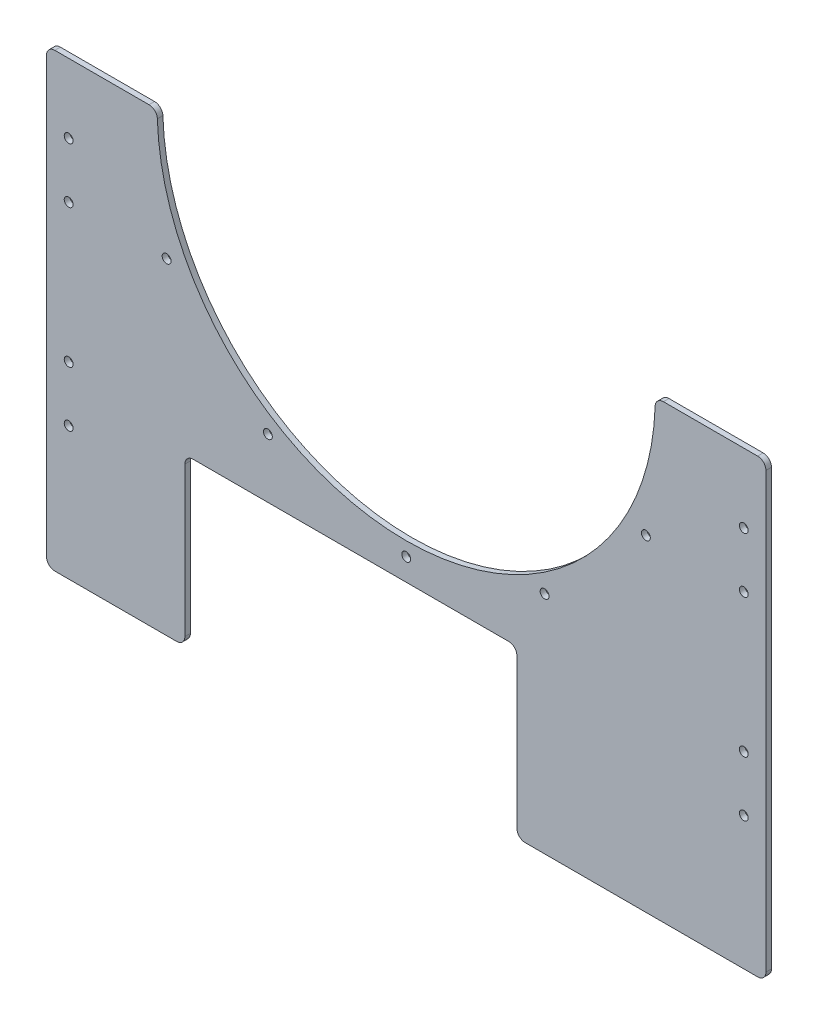
ISO-10303-21;
HEADER;
FILE_DESCRIPTION(('STEP AP214'),'2;1');
FILE_NAME('part.step','',(''),(''),'','','');
FILE_SCHEMA(('AUTOMOTIVE_DESIGN { 1 0 10303 214 1 1 1 1 }'));
ENDSEC;
DATA;
#1=APPLICATION_CONTEXT('core data for automotive mechanical design processes');
#2=APPLICATION_PROTOCOL_DEFINITION('international standard','automotive_design',2000,#1);
#3=PRODUCT_CONTEXT('',#1,'mechanical');
#4=PRODUCT('Part','Part','',(#3));
#5=PRODUCT_RELATED_PRODUCT_CATEGORY('part','',(#4));
#6=PRODUCT_DEFINITION_FORMATION('','',#4);
#7=PRODUCT_DEFINITION_CONTEXT('part definition',#1,'design');
#8=PRODUCT_DEFINITION('design','',#6,#7);
#9=PRODUCT_DEFINITION_SHAPE('','',#8);
#10=(LENGTH_UNIT() NAMED_UNIT(*) SI_UNIT(.MILLI.,.METRE.));
#11=(NAMED_UNIT(*) PLANE_ANGLE_UNIT() SI_UNIT($,.RADIAN.));
#12=(NAMED_UNIT(*) SI_UNIT($,.STERADIAN.) SOLID_ANGLE_UNIT());
#13=UNCERTAINTY_MEASURE_WITH_UNIT(LENGTH_MEASURE(1.E-05),#10,'distance_accuracy_value','');
#14=(GEOMETRIC_REPRESENTATION_CONTEXT(3) GLOBAL_UNCERTAINTY_ASSIGNED_CONTEXT((#13)) GLOBAL_UNIT_ASSIGNED_CONTEXT((#10,
#11,#12)) REPRESENTATION_CONTEXT('',''));
#15=CARTESIAN_POINT('',(0.,0.,0.));
#16=DIRECTION('',(0.,0.,1.));
#17=DIRECTION('',(1.,0.,0.));
#18=AXIS2_PLACEMENT_3D('',#15,#16,#17);
#19=CARTESIAN_POINT('',(130.,-81.5,2.));
#20=DIRECTION('',(0.,1.,0.));
#21=DIRECTION('',(-1.,0.,0.));
#22=AXIS2_PLACEMENT_3D('',#19,#20,#21);
#23=PLANE('',#22);
#24=DIRECTION('',(1.,0.,0.));
#25=VECTOR('',#24,1.);
#26=CARTESIAN_POINT('',(130.,-81.5,0.));
#27=LINE('',#26,#25);
#28=CARTESIAN_POINT('',(-127.,-81.5,0.));
#29=VERTEX_POINT('',#28);
#30=CARTESIAN_POINT('',(-83.,-81.5,0.));
#31=VERTEX_POINT('',#30);
#32=EDGE_CURVE('E415',#29,#31,#27,.T.);
#33=ORIENTED_EDGE('',*,*,#32,.T.);
#34=DIRECTION('',(0.,0.,1.));
#35=VECTOR('',#34,1.);
#36=CARTESIAN_POINT('',(-83.,-81.5,2.));
#37=LINE('',#36,#35);
#38=CARTESIAN_POINT('',(-83.,-81.5,2.));
#39=VERTEX_POINT('',#38);
#40=EDGE_CURVE('E243',#31,#39,#37,.T.);
#41=ORIENTED_EDGE('',*,*,#40,.T.);
#42=DIRECTION('',(1.,0.,0.));
#43=VECTOR('',#42,1.);
#44=CARTESIAN_POINT('',(130.,-81.5,2.));
#45=LINE('',#44,#43);
#46=CARTESIAN_POINT('',(-127.,-81.5,2.));
#47=VERTEX_POINT('',#46);
#48=EDGE_CURVE('E406',#47,#39,#45,.T.);
#49=ORIENTED_EDGE('',*,*,#48,.F.);
#50=DIRECTION('',(0.,0.,-1.));
#51=VECTOR('',#50,1.);
#52=CARTESIAN_POINT('',(-127.,-81.5,2.));
#53=LINE('',#52,#51);
#54=EDGE_CURVE('E230',#47,#29,#53,.T.);
#55=ORIENTED_EDGE('',*,*,#54,.T.);
#56=EDGE_LOOP('',(#33,#41,#49,#55));
#57=FACE_BOUND('',#56,.T.);
#58=ADVANCED_FACE('F34',(#57),#23,.F.);
#59=CARTESIAN_POINT('',(130.,81.5,2.));
#60=DIRECTION('',(0.,-1.,0.));
#61=DIRECTION('',(1.,0.,0.));
#62=AXIS2_PLACEMENT_3D('',#59,#60,#61);
#63=PLANE('',#62);
#64=DIRECTION('',(-1.,0.,0.));
#65=VECTOR('',#64,1.);
#66=CARTESIAN_POINT('',(130.,81.5,0.));
#67=LINE('',#66,#65);
#68=CARTESIAN_POINT('',(127.,81.5,0.));
#69=VERTEX_POINT('',#68);
#70=CARTESIAN_POINT('',(92.951600308978,81.5,0.));
#71=VERTEX_POINT('',#70);
#72=EDGE_CURVE('E189',#69,#71,#67,.T.);
#73=ORIENTED_EDGE('',*,*,#72,.T.);
#74=DIRECTION('',(0.,0.,1.));
#75=VECTOR('',#74,1.);
#76=CARTESIAN_POINT('',(92.951600308978,81.5,2.));
#77=LINE('',#76,#75);
#78=CARTESIAN_POINT('',(92.951600308978,81.5,2.));
#79=VERTEX_POINT('',#78);
#80=EDGE_CURVE('E265',#71,#79,#77,.T.);
#81=ORIENTED_EDGE('',*,*,#80,.T.);
#82=DIRECTION('',(-1.,0.,0.));
#83=VECTOR('',#82,1.);
#84=CARTESIAN_POINT('',(130.,81.5,2.));
#85=LINE('',#84,#83);
#86=CARTESIAN_POINT('',(127.,81.5,2.));
#87=VERTEX_POINT('',#86);
#88=EDGE_CURVE('E192',#87,#79,#85,.T.);
#89=ORIENTED_EDGE('',*,*,#88,.F.);
#90=DIRECTION('',(0.,0.,-1.));
#91=VECTOR('',#90,1.);
#92=CARTESIAN_POINT('',(127.,81.5,2.));
#93=LINE('',#92,#91);
#94=EDGE_CURVE('E176',#87,#69,#93,.T.);
#95=ORIENTED_EDGE('',*,*,#94,.T.);
#96=EDGE_LOOP('',(#73,#81,#89,#95));
#97=FACE_BOUND('',#96,.T.);
#98=ADVANCED_FACE('F187',(#97),#63,.F.);
#99=CARTESIAN_POINT('',(-130.,-81.5,2.));
#100=DIRECTION('',(1.,0.,0.));
#101=DIRECTION('',(0.,0.,-1.));
#102=AXIS2_PLACEMENT_3D('',#99,#100,#101);
#103=PLANE('',#102);
#104=DIRECTION('',(0.,-1.,0.));
#105=VECTOR('',#104,1.);
#106=CARTESIAN_POINT('',(-130.,-81.5,0.));
#107=LINE('',#106,#105);
#108=CARTESIAN_POINT('',(-130.,78.5,0.));
#109=VERTEX_POINT('',#108);
#110=CARTESIAN_POINT('',(-130.,-78.5,0.));
#111=VERTEX_POINT('',#110);
#112=EDGE_CURVE('E403',#109,#111,#107,.T.);
#113=ORIENTED_EDGE('',*,*,#112,.T.);
#114=DIRECTION('',(0.,0.,-1.));
#115=VECTOR('',#114,1.);
#116=CARTESIAN_POINT('',(-130.,-78.5,2.));
#117=LINE('',#116,#115);
#118=CARTESIAN_POINT('',(-130.,-78.5,2.));
#119=VERTEX_POINT('',#118);
#120=EDGE_CURVE('E239',#111,#119,#117,.F.);
#121=ORIENTED_EDGE('',*,*,#120,.T.);
#122=DIRECTION('',(0.,-1.,0.));
#123=VECTOR('',#122,1.);
#124=CARTESIAN_POINT('',(-130.,-81.5,2.));
#125=LINE('',#124,#123);
#126=CARTESIAN_POINT('',(-130.,78.5,2.));
#127=VERTEX_POINT('',#126);
#128=EDGE_CURVE('E201',#127,#119,#125,.T.);
#129=ORIENTED_EDGE('',*,*,#128,.F.);
#130=DIRECTION('',(0.,0.,-1.));
#131=VECTOR('',#130,1.);
#132=CARTESIAN_POINT('',(-130.,78.5,2.));
#133=LINE('',#132,#131);
#134=EDGE_CURVE('E236',#127,#109,#133,.T.);
#135=ORIENTED_EDGE('',*,*,#134,.T.);
#136=EDGE_LOOP('',(#113,#121,#129,#135));
#137=FACE_BOUND('',#136,.T.);
#138=ADVANCED_FACE('F441',(#137),#103,.F.);
#139=CARTESIAN_POINT('',(43.,-81.5,2.));
#140=VERTEX_POINT('',#139);
#141=CARTESIAN_POINT('',(127.,-81.5,2.));
#142=VERTEX_POINT('',#141);
#143=EDGE_CURVE('E205',#140,#142,#45,.T.);
#144=ORIENTED_EDGE('',*,*,#143,.F.);
#145=DIRECTION('',(0.,0.,1.));
#146=VECTOR('',#145,1.);
#147=CARTESIAN_POINT('',(43.,-81.5,2.));
#148=LINE('',#147,#146);
#149=CARTESIAN_POINT('',(43.,-81.5,0.));
#150=VERTEX_POINT('',#149);
#151=EDGE_CURVE('E275',#140,#150,#148,.F.);
#152=ORIENTED_EDGE('',*,*,#151,.T.);
#153=CARTESIAN_POINT('',(127.,-81.5,0.));
#154=VERTEX_POINT('',#153);
#155=EDGE_CURVE('E414',#150,#154,#27,.T.);
#156=ORIENTED_EDGE('',*,*,#155,.T.);
#157=DIRECTION('',(0.,0.,-1.));
#158=VECTOR('',#157,1.);
#159=CARTESIAN_POINT('',(127.,-81.5,2.));
#160=LINE('',#159,#158);
#161=EDGE_CURVE('E233',#154,#142,#160,.F.);
#162=ORIENTED_EDGE('',*,*,#161,.T.);
#163=EDGE_LOOP('',(#144,#152,#156,#162));
#164=FACE_BOUND('',#163,.T.);
#165=ADVANCED_FACE('F422',(#164),#23,.F.);
#166=CARTESIAN_POINT('',(130.,-81.5,2.));
#167=DIRECTION('',(-1.,0.,0.));
#168=DIRECTION('',(0.,0.,1.));
#169=AXIS2_PLACEMENT_3D('',#166,#167,#168);
#170=PLANE('',#169);
#171=DIRECTION('',(0.,1.,0.));
#172=VECTOR('',#171,1.);
#173=CARTESIAN_POINT('',(130.,-81.5,0.));
#174=LINE('',#173,#172);
#175=CARTESIAN_POINT('',(130.,-78.5,0.));
#176=VERTEX_POINT('',#175);
#177=CARTESIAN_POINT('',(130.,78.5,0.));
#178=VERTEX_POINT('',#177);
#179=EDGE_CURVE('E207',#176,#178,#174,.T.);
#180=ORIENTED_EDGE('',*,*,#179,.T.);
#181=DIRECTION('',(0.,0.,-1.));
#182=VECTOR('',#181,1.);
#183=CARTESIAN_POINT('',(130.,78.5,2.));
#184=LINE('',#183,#182);
#185=CARTESIAN_POINT('',(130.,78.5,2.));
#186=VERTEX_POINT('',#185);
#187=EDGE_CURVE('E177',#178,#186,#184,.F.);
#188=ORIENTED_EDGE('',*,*,#187,.T.);
#189=DIRECTION('',(0.,1.,0.));
#190=VECTOR('',#189,1.);
#191=CARTESIAN_POINT('',(130.,-81.5,2.));
#192=LINE('',#191,#190);
#193=CARTESIAN_POINT('',(130.,-78.5,2.));
#194=VERTEX_POINT('',#193);
#195=EDGE_CURVE('E408',#194,#186,#192,.T.);
#196=ORIENTED_EDGE('',*,*,#195,.F.);
#197=DIRECTION('',(0.,0.,-1.));
#198=VECTOR('',#197,1.);
#199=CARTESIAN_POINT('',(130.,-78.5,2.));
#200=LINE('',#199,#198);
#201=EDGE_CURVE('E181',#194,#176,#200,.T.);
#202=ORIENTED_EDGE('',*,*,#201,.T.);
#203=EDGE_LOOP('',(#180,#188,#196,#202));
#204=FACE_BOUND('',#203,.T.);
#205=ADVANCED_FACE('F431',(#204),#170,.F.);
#206=CARTESIAN_POINT('',(-92.951600308978,81.5,2.));
#207=VERTEX_POINT('',#206);
#208=CARTESIAN_POINT('',(-127.,81.5,2.));
#209=VERTEX_POINT('',#208);
#210=EDGE_CURVE('E411',#207,#209,#85,.T.);
#211=ORIENTED_EDGE('',*,*,#210,.F.);
#212=DIRECTION('',(0.,0.,1.));
#213=VECTOR('',#212,1.);
#214=CARTESIAN_POINT('',(-92.951600308978,81.5,2.));
#215=LINE('',#214,#213);
#216=CARTESIAN_POINT('',(-92.951600308978,81.5,0.));
#217=VERTEX_POINT('',#216);
#218=EDGE_CURVE('E282',#207,#217,#215,.F.);
#219=ORIENTED_EDGE('',*,*,#218,.T.);
#220=CARTESIAN_POINT('',(-127.,81.5,0.));
#221=VERTEX_POINT('',#220);
#222=EDGE_CURVE('E202',#217,#221,#67,.T.);
#223=ORIENTED_EDGE('',*,*,#222,.T.);
#224=DIRECTION('',(0.,0.,-1.));
#225=VECTOR('',#224,1.);
#226=CARTESIAN_POINT('',(-127.,81.5,2.));
#227=LINE('',#226,#225);
#228=EDGE_CURVE('E194',#221,#209,#227,.F.);
#229=ORIENTED_EDGE('',*,*,#228,.T.);
#230=EDGE_LOOP('',(#211,#219,#223,#229));
#231=FACE_BOUND('',#230,.T.);
#232=ADVANCED_FACE('F433',(#231),#63,.F.);
#233=CARTESIAN_POINT('',(0.,0.,2.));
#234=DIRECTION('',(0.,0.,1.));
#235=DIRECTION('',(1.,0.,0.));
#236=AXIS2_PLACEMENT_3D('',#233,#234,#235);
#237=PLANE('',#236);
#238=ORIENTED_EDGE('',*,*,#48,.T.);
#239=CARTESIAN_POINT('',(-83.,-78.5,2.));
#240=DIRECTION('',(0.,0.,1.));
#241=DIRECTION('',(1.,0.,0.));
#242=AXIS2_PLACEMENT_3D('',#239,#240,#241);
#243=CIRCLE('',#242,3.);
#244=CARTESIAN_POINT('',(-80.,-78.5,2.));
#245=VERTEX_POINT('',#244);
#246=EDGE_CURVE('E252',#39,#245,#243,.T.);
#247=ORIENTED_EDGE('',*,*,#246,.T.);
#248=DIRECTION('',(0.,-1.,0.));
#249=VECTOR('',#248,1.);
#250=CARTESIAN_POINT('',(-80.,-81.5,2.));
#251=LINE('',#250,#249);
#252=CARTESIAN_POINT('',(-80.,-24.5,2.));
#253=VERTEX_POINT('',#252);
#254=EDGE_CURVE('E297',#253,#245,#251,.T.);
#255=ORIENTED_EDGE('',*,*,#254,.F.);
#256=CARTESIAN_POINT('',(-77.,-24.5,2.));
#257=DIRECTION('',(0.,0.,1.));
#258=DIRECTION('',(1.,0.,0.));
#259=AXIS2_PLACEMENT_3D('',#256,#257,#258);
#260=CIRCLE('',#259,3.);
#261=CARTESIAN_POINT('',(-77.,-21.5,2.));
#262=VERTEX_POINT('',#261);
#263=EDGE_CURVE('E42',#253,#262,#260,.F.);
#264=ORIENTED_EDGE('',*,*,#263,.T.);
#265=DIRECTION('',(-1.,0.,0.));
#266=VECTOR('',#265,1.);
#267=CARTESIAN_POINT('',(-80.,-21.5,2.));
#268=LINE('',#267,#266);
#269=CARTESIAN_POINT('',(37.,-21.5,2.));
#270=VERTEX_POINT('',#269);
#271=EDGE_CURVE('E295',#270,#262,#268,.T.);
#272=ORIENTED_EDGE('',*,*,#271,.F.);
#273=CARTESIAN_POINT('',(37.,-24.5,2.));
#274=DIRECTION('',(0.,0.,1.));
#275=DIRECTION('',(1.,0.,0.));
#276=AXIS2_PLACEMENT_3D('',#273,#274,#275);
#277=CIRCLE('',#276,3.);
#278=CARTESIAN_POINT('',(40.,-24.5,2.));
#279=VERTEX_POINT('',#278);
#280=EDGE_CURVE('E285',#270,#279,#277,.F.);
#281=ORIENTED_EDGE('',*,*,#280,.T.);
#282=DIRECTION('',(0.,1.,0.));
#283=VECTOR('',#282,1.);
#284=CARTESIAN_POINT('',(40.,-81.5,2.));
#285=LINE('',#284,#283);
#286=CARTESIAN_POINT('',(40.,-78.5,2.));
#287=VERTEX_POINT('',#286);
#288=EDGE_CURVE('E307',#287,#279,#285,.T.);
#289=ORIENTED_EDGE('',*,*,#288,.F.);
#290=CARTESIAN_POINT('',(43.,-78.5,2.));
#291=DIRECTION('',(0.,0.,1.));
#292=DIRECTION('',(1.,0.,0.));
#293=AXIS2_PLACEMENT_3D('',#290,#291,#292);
#294=CIRCLE('',#293,3.);
#295=EDGE_CURVE('E248',#287,#140,#294,.T.);
#296=ORIENTED_EDGE('',*,*,#295,.T.);
#297=ORIENTED_EDGE('',*,*,#143,.T.);
#298=CARTESIAN_POINT('',(127.,-78.5,2.));
#299=DIRECTION('',(0.,0.,1.));
#300=DIRECTION('',(1.,0.,0.));
#301=AXIS2_PLACEMENT_3D('',#298,#299,#300);
#302=CIRCLE('',#301,3.);
#303=EDGE_CURVE('E226',#142,#194,#302,.T.);
#304=ORIENTED_EDGE('',*,*,#303,.T.);
#305=ORIENTED_EDGE('',*,*,#195,.T.);
#306=CARTESIAN_POINT('',(127.,78.5,2.));
#307=DIRECTION('',(0.,0.,1.));
#308=DIRECTION('',(1.,0.,0.));
#309=AXIS2_PLACEMENT_3D('',#306,#307,#308);
#310=CIRCLE('',#309,3.);
#311=EDGE_CURVE('E228',#186,#87,#310,.T.);
#312=ORIENTED_EDGE('',*,*,#311,.T.);
#313=ORIENTED_EDGE('',*,*,#88,.T.);
#314=CARTESIAN_POINT('',(92.951600308978,78.5,2.));
#315=DIRECTION('',(0.,0.,1.));
#316=DIRECTION('',(1.,0.,0.));
#317=AXIS2_PLACEMENT_3D('',#314,#315,#316);
#318=CIRCLE('',#317,3.);
#319=CARTESIAN_POINT('',(89.9531615893336,78.5967741935484,2.));
#320=VERTEX_POINT('',#319);
#321=EDGE_CURVE('E250',#79,#320,#318,.T.);
#322=ORIENTED_EDGE('',*,*,#321,.T.);
#323=CARTESIAN_POINT('',(0.,81.5,2.));
#324=DIRECTION('',(0.,0.,1.));
#325=DIRECTION('',(1.,0.,0.));
#326=AXIS2_PLACEMENT_3D('',#323,#324,#325);
#327=CIRCLE('',#326,90.);
#328=CARTESIAN_POINT('',(-89.9531615893336,78.5967741935484,2.));
#329=VERTEX_POINT('',#328);
#330=EDGE_CURVE('E334',#329,#320,#327,.T.);
#331=ORIENTED_EDGE('',*,*,#330,.F.);
#332=CARTESIAN_POINT('',(-92.951600308978,78.5,2.));
#333=DIRECTION('',(0.,0.,1.));
#334=DIRECTION('',(1.,0.,0.));
#335=AXIS2_PLACEMENT_3D('',#332,#333,#334);
#336=CIRCLE('',#335,3.);
#337=EDGE_CURVE('E246',#329,#207,#336,.T.);
#338=ORIENTED_EDGE('',*,*,#337,.T.);
#339=ORIENTED_EDGE('',*,*,#210,.T.);
#340=CARTESIAN_POINT('',(-127.,78.5,2.));
#341=DIRECTION('',(0.,0.,1.));
#342=DIRECTION('',(1.,0.,0.));
#343=AXIS2_PLACEMENT_3D('',#340,#341,#342);
#344=CIRCLE('',#343,3.);
#345=EDGE_CURVE('E222',#209,#127,#344,.T.);
#346=ORIENTED_EDGE('',*,*,#345,.T.);
#347=ORIENTED_EDGE('',*,*,#128,.T.);
#348=CARTESIAN_POINT('',(-127.,-78.5,2.));
#349=DIRECTION('',(0.,0.,1.));
#350=DIRECTION('',(1.,0.,0.));
#351=AXIS2_PLACEMENT_3D('',#348,#349,#350);
#352=CIRCLE('',#351,3.);
#353=EDGE_CURVE('E224',#119,#47,#352,.T.);
#354=ORIENTED_EDGE('',*,*,#353,.T.);
#355=EDGE_LOOP('',(#238,#247,#255,#264,#272,#281,#289,#296,#297,#304,#305,#312,#313,#322,#331,
#338,#339,#346,#347,#354));
#356=FACE_BOUND('',#355,.T.);
#357=CARTESIAN_POINT('',(0.,-13.5,2.));
#358=DIRECTION('',(0.,0.,1.));
#359=DIRECTION('',(1.,0.,0.));
#360=AXIS2_PLACEMENT_3D('',#357,#358,#359);
#361=CIRCLE('',#360,1.6);
#362=CARTESIAN_POINT('',(1.6,-13.5,2.));
#363=VERTEX_POINT('',#362);
#364=EDGE_CURVE('E335',#363,#363,#361,.T.);
#365=ORIENTED_EDGE('',*,*,#364,.F.);
#366=EDGE_LOOP('',(#365));
#367=FACE_BOUND('',#366,.T.);
#368=CARTESIAN_POINT('',(-50.,-0.102540378443875,2.));
#369=DIRECTION('',(0.,0.,1.));
#370=DIRECTION('',(1.,0.,0.));
#371=AXIS2_PLACEMENT_3D('',#368,#369,#370);
#372=CIRCLE('',#371,1.6);
#373=CARTESIAN_POINT('',(-48.4,-0.102540378443875,2.));
#374=VERTEX_POINT('',#373);
#375=EDGE_CURVE('E341',#374,#374,#372,.T.);
#376=ORIENTED_EDGE('',*,*,#375,.F.);
#377=EDGE_LOOP('',(#376));
#378=FACE_BOUND('',#377,.T.);
#379=CARTESIAN_POINT('',(-86.6025403784439,36.5,2.));
#380=DIRECTION('',(0.,0.,1.));
#381=DIRECTION('',(1.,0.,0.));
#382=AXIS2_PLACEMENT_3D('',#379,#380,#381);
#383=CIRCLE('',#382,1.60000000000001);
#384=CARTESIAN_POINT('',(-85.0025403784439,36.5,2.));
#385=VERTEX_POINT('',#384);
#386=EDGE_CURVE('E347',#385,#385,#383,.T.);
#387=ORIENTED_EDGE('',*,*,#386,.F.);
#388=EDGE_LOOP('',(#387));
#389=FACE_BOUND('',#388,.T.);
#390=CARTESIAN_POINT('',(86.6025403784439,36.5,2.));
#391=DIRECTION('',(0.,0.,1.));
#392=DIRECTION('',(1.,0.,0.));
#393=AXIS2_PLACEMENT_3D('',#390,#391,#392);
#394=CIRCLE('',#393,1.60000000000001);
#395=CARTESIAN_POINT('',(88.2025403784439,36.5,2.));
#396=VERTEX_POINT('',#395);
#397=EDGE_CURVE('E328',#396,#396,#394,.T.);
#398=ORIENTED_EDGE('',*,*,#397,.F.);
#399=EDGE_LOOP('',(#398));
#400=FACE_BOUND('',#399,.T.);
#401=CARTESIAN_POINT('',(50.0000000000001,-0.102540378443844,2.));
#402=DIRECTION('',(0.,0.,1.));
#403=DIRECTION('',(1.,0.,0.));
#404=AXIS2_PLACEMENT_3D('',#401,#402,#403);
#405=CIRCLE('',#404,1.6);
#406=CARTESIAN_POINT('',(51.6000000000001,-0.102540378443844,2.));
#407=VERTEX_POINT('',#406);
#408=EDGE_CURVE('E322',#407,#407,#405,.T.);
#409=ORIENTED_EDGE('',*,*,#408,.F.);
#410=EDGE_LOOP('',(#409));
#411=FACE_BOUND('',#410,.T.);
#412=CARTESIAN_POINT('',(-122.,-13.5,2.));
#413=DIRECTION('',(0.,0.,1.));
#414=DIRECTION('',(1.,0.,0.));
#415=AXIS2_PLACEMENT_3D('',#412,#413,#414);
#416=CIRCLE('',#415,1.60000000000002);
#417=CARTESIAN_POINT('',(-120.4,-13.5,2.));
#418=VERTEX_POINT('',#417);
#419=EDGE_CURVE('E380',#418,#418,#416,.T.);
#420=ORIENTED_EDGE('',*,*,#419,.F.);
#421=EDGE_LOOP('',(#420));
#422=FACE_BOUND('',#421,.T.);
#423=CARTESIAN_POINT('',(-122.,36.5,2.));
#424=DIRECTION('',(0.,0.,1.));
#425=DIRECTION('',(1.,0.,0.));
#426=AXIS2_PLACEMENT_3D('',#423,#424,#425);
#427=CIRCLE('',#426,1.60000000000002);
#428=CARTESIAN_POINT('',(-120.4,36.5,2.));
#429=VERTEX_POINT('',#428);
#430=EDGE_CURVE('E386',#429,#429,#427,.T.);
#431=ORIENTED_EDGE('',*,*,#430,.F.);
#432=EDGE_LOOP('',(#431));
#433=FACE_BOUND('',#432,.T.);
#434=CARTESIAN_POINT('',(-122.,56.5,2.));
#435=DIRECTION('',(0.,0.,1.));
#436=DIRECTION('',(1.,0.,0.));
#437=AXIS2_PLACEMENT_3D('',#434,#435,#436);
#438=CIRCLE('',#437,1.60000000000002);
#439=CARTESIAN_POINT('',(-120.4,56.5,2.));
#440=VERTEX_POINT('',#439);
#441=EDGE_CURVE('E392',#440,#440,#438,.T.);
#442=ORIENTED_EDGE('',*,*,#441,.F.);
#443=EDGE_LOOP('',(#442));
#444=FACE_BOUND('',#443,.T.);
#445=CARTESIAN_POINT('',(122.,56.5,2.));
#446=DIRECTION('',(0.,0.,1.));
#447=DIRECTION('',(-1.,0.,0.));
#448=AXIS2_PLACEMENT_3D('',#445,#446,#447);
#449=CIRCLE('',#448,1.60000000000002);
#450=CARTESIAN_POINT('',(120.4,56.5,2.));
#451=VERTEX_POINT('',#450);
#452=EDGE_CURVE('E361',#451,#451,#449,.T.);
#453=ORIENTED_EDGE('',*,*,#452,.F.);
#454=EDGE_LOOP('',(#453));
#455=FACE_BOUND('',#454,.T.);
#456=CARTESIAN_POINT('',(122.,36.5,2.));
#457=DIRECTION('',(0.,0.,1.));
#458=DIRECTION('',(-1.,0.,0.));
#459=AXIS2_PLACEMENT_3D('',#456,#457,#458);
#460=CIRCLE('',#459,1.60000000000002);
#461=CARTESIAN_POINT('',(120.4,36.5,2.));
#462=VERTEX_POINT('',#461);
#463=EDGE_CURVE('E362',#462,#462,#460,.T.);
#464=ORIENTED_EDGE('',*,*,#463,.F.);
#465=EDGE_LOOP('',(#464));
#466=FACE_BOUND('',#465,.T.);
#467=CARTESIAN_POINT('',(122.,-13.5,2.));
#468=DIRECTION('',(0.,0.,1.));
#469=DIRECTION('',(-1.,0.,0.));
#470=AXIS2_PLACEMENT_3D('',#467,#468,#469);
#471=CIRCLE('',#470,1.60000000000002);
#472=CARTESIAN_POINT('',(120.4,-13.5,2.));
#473=VERTEX_POINT('',#472);
#474=EDGE_CURVE('E368',#473,#473,#471,.T.);
#475=ORIENTED_EDGE('',*,*,#474,.F.);
#476=EDGE_LOOP('',(#475));
#477=FACE_BOUND('',#476,.T.);
#478=CARTESIAN_POINT('',(122.,-33.5,2.));
#479=DIRECTION('',(0.,0.,1.));
#480=DIRECTION('',(-1.,0.,0.));
#481=AXIS2_PLACEMENT_3D('',#478,#479,#480);
#482=CIRCLE('',#481,1.60000000000002);
#483=CARTESIAN_POINT('',(120.4,-33.5,2.));
#484=VERTEX_POINT('',#483);
#485=EDGE_CURVE('E357',#484,#484,#482,.T.);
#486=ORIENTED_EDGE('',*,*,#485,.F.);
#487=EDGE_LOOP('',(#486));
#488=FACE_BOUND('',#487,.T.);
#489=CARTESIAN_POINT('',(-122.,-33.5,2.));
#490=DIRECTION('',(0.,0.,1.));
#491=DIRECTION('',(1.,0.,0.));
#492=AXIS2_PLACEMENT_3D('',#489,#490,#491);
#493=CIRCLE('',#492,1.60000000000002);
#494=CARTESIAN_POINT('',(-120.4,-33.5,2.));
#495=VERTEX_POINT('',#494);
#496=EDGE_CURVE('E379',#495,#495,#493,.T.);
#497=ORIENTED_EDGE('',*,*,#496,.F.);
#498=EDGE_LOOP('',(#497));
#499=FACE_BOUND('',#498,.T.);
#500=ADVANCED_FACE('F293',(#356,#367,#378,#389,#400,#411,#422,#433,#444,#455,#466,#477,#488,
#499),#237,.T.);
#501=CARTESIAN_POINT('',(0.,0.,0.));
#502=DIRECTION('',(0.,0.,1.));
#503=DIRECTION('',(1.,0.,0.));
#504=AXIS2_PLACEMENT_3D('',#501,#502,#503);
#505=PLANE('',#504);
#506=CARTESIAN_POINT('',(0.,-13.5,0.));
#507=DIRECTION('',(0.,0.,1.));
#508=DIRECTION('',(1.,0.,0.));
#509=AXIS2_PLACEMENT_3D('',#506,#507,#508);
#510=CIRCLE('',#509,1.6);
#511=CARTESIAN_POINT('',(1.6,-13.5,0.));
#512=VERTEX_POINT('',#511);
#513=EDGE_CURVE('E331',#512,#512,#510,.T.);
#514=ORIENTED_EDGE('',*,*,#513,.T.);
#515=EDGE_LOOP('',(#514));
#516=FACE_BOUND('',#515,.T.);
#517=CARTESIAN_POINT('',(-50.,-0.102540378443875,0.));
#518=DIRECTION('',(0.,0.,1.));
#519=DIRECTION('',(1.,0.,0.));
#520=AXIS2_PLACEMENT_3D('',#517,#518,#519);
#521=CIRCLE('',#520,1.6);
#522=CARTESIAN_POINT('',(-48.4,-0.102540378443875,0.));
#523=VERTEX_POINT('',#522);
#524=EDGE_CURVE('E338',#523,#523,#521,.T.);
#525=ORIENTED_EDGE('',*,*,#524,.T.);
#526=EDGE_LOOP('',(#525));
#527=FACE_BOUND('',#526,.T.);
#528=CARTESIAN_POINT('',(-86.6025403784439,36.5,0.));
#529=DIRECTION('',(0.,0.,1.));
#530=DIRECTION('',(1.,0.,0.));
#531=AXIS2_PLACEMENT_3D('',#528,#529,#530);
#532=CIRCLE('',#531,1.60000000000001);
#533=CARTESIAN_POINT('',(-85.0025403784439,36.5,0.));
#534=VERTEX_POINT('',#533);
#535=EDGE_CURVE('E344',#534,#534,#532,.T.);
#536=ORIENTED_EDGE('',*,*,#535,.T.);
#537=EDGE_LOOP('',(#536));
#538=FACE_BOUND('',#537,.T.);
#539=CARTESIAN_POINT('',(86.6025403784439,36.5,0.));
#540=DIRECTION('',(0.,0.,1.));
#541=DIRECTION('',(1.,0.,0.));
#542=AXIS2_PLACEMENT_3D('',#539,#540,#541);
#543=CIRCLE('',#542,1.60000000000001);
#544=CARTESIAN_POINT('',(88.2025403784439,36.5,0.));
#545=VERTEX_POINT('',#544);
#546=EDGE_CURVE('E350',#545,#545,#543,.T.);
#547=ORIENTED_EDGE('',*,*,#546,.T.);
#548=EDGE_LOOP('',(#547));
#549=FACE_BOUND('',#548,.T.);
#550=CARTESIAN_POINT('',(50.0000000000001,-0.102540378443844,0.));
#551=DIRECTION('',(0.,0.,1.));
#552=DIRECTION('',(1.,0.,0.));
#553=AXIS2_PLACEMENT_3D('',#550,#551,#552);
#554=CIRCLE('',#553,1.6);
#555=CARTESIAN_POINT('',(51.6000000000001,-0.102540378443844,0.));
#556=VERTEX_POINT('',#555);
#557=EDGE_CURVE('E325',#556,#556,#554,.T.);
#558=ORIENTED_EDGE('',*,*,#557,.T.);
#559=EDGE_LOOP('',(#558));
#560=FACE_BOUND('',#559,.T.);
#561=CARTESIAN_POINT('',(-122.,-13.5,0.));
#562=DIRECTION('',(0.,0.,1.));
#563=DIRECTION('',(1.,0.,0.));
#564=AXIS2_PLACEMENT_3D('',#561,#562,#563);
#565=CIRCLE('',#564,1.60000000000002);
#566=CARTESIAN_POINT('',(-120.4,-13.5,0.));
#567=VERTEX_POINT('',#566);
#568=EDGE_CURVE('E376',#567,#567,#565,.T.);
#569=ORIENTED_EDGE('',*,*,#568,.T.);
#570=EDGE_LOOP('',(#569));
#571=FACE_BOUND('',#570,.T.);
#572=CARTESIAN_POINT('',(-122.,36.5,0.));
#573=DIRECTION('',(0.,0.,1.));
#574=DIRECTION('',(1.,0.,0.));
#575=AXIS2_PLACEMENT_3D('',#572,#573,#574);
#576=CIRCLE('',#575,1.60000000000002);
#577=CARTESIAN_POINT('',(-120.4,36.5,0.));
#578=VERTEX_POINT('',#577);
#579=EDGE_CURVE('E383',#578,#578,#576,.T.);
#580=ORIENTED_EDGE('',*,*,#579,.T.);
#581=EDGE_LOOP('',(#580));
#582=FACE_BOUND('',#581,.T.);
#583=CARTESIAN_POINT('',(-122.,56.5,0.));
#584=DIRECTION('',(0.,0.,1.));
#585=DIRECTION('',(1.,0.,0.));
#586=AXIS2_PLACEMENT_3D('',#583,#584,#585);
#587=CIRCLE('',#586,1.60000000000002);
#588=CARTESIAN_POINT('',(-120.4,56.5,0.));
#589=VERTEX_POINT('',#588);
#590=EDGE_CURVE('E389',#589,#589,#587,.T.);
#591=ORIENTED_EDGE('',*,*,#590,.T.);
#592=EDGE_LOOP('',(#591));
#593=FACE_BOUND('',#592,.T.);
#594=CARTESIAN_POINT('',(122.,56.5,0.));
#595=DIRECTION('',(0.,0.,1.));
#596=DIRECTION('',(-1.,0.,0.));
#597=AXIS2_PLACEMENT_3D('',#594,#595,#596);
#598=CIRCLE('',#597,1.60000000000002);
#599=CARTESIAN_POINT('',(120.4,56.5,0.));
#600=VERTEX_POINT('',#599);
#601=EDGE_CURVE('E395',#600,#600,#598,.T.);
#602=ORIENTED_EDGE('',*,*,#601,.T.);
#603=EDGE_LOOP('',(#602));
#604=FACE_BOUND('',#603,.T.);
#605=CARTESIAN_POINT('',(122.,36.5,0.));
#606=DIRECTION('',(0.,0.,1.));
#607=DIRECTION('',(-1.,0.,0.));
#608=AXIS2_PLACEMENT_3D('',#605,#606,#607);
#609=CIRCLE('',#608,1.60000000000002);
#610=CARTESIAN_POINT('',(120.4,36.5,0.));
#611=VERTEX_POINT('',#610);
#612=EDGE_CURVE('E358',#611,#611,#609,.T.);
#613=ORIENTED_EDGE('',*,*,#612,.T.);
#614=EDGE_LOOP('',(#613));
#615=FACE_BOUND('',#614,.T.);
#616=CARTESIAN_POINT('',(122.,-13.5,0.));
#617=DIRECTION('',(0.,0.,1.));
#618=DIRECTION('',(-1.,0.,0.));
#619=AXIS2_PLACEMENT_3D('',#616,#617,#618);
#620=CIRCLE('',#619,1.60000000000002);
#621=CARTESIAN_POINT('',(120.4,-13.5,0.));
#622=VERTEX_POINT('',#621);
#623=EDGE_CURVE('E365',#622,#622,#620,.T.);
#624=ORIENTED_EDGE('',*,*,#623,.T.);
#625=EDGE_LOOP('',(#624));
#626=FACE_BOUND('',#625,.T.);
#627=CARTESIAN_POINT('',(122.,-33.5,0.));
#628=DIRECTION('',(0.,0.,1.));
#629=DIRECTION('',(-1.,0.,0.));
#630=AXIS2_PLACEMENT_3D('',#627,#628,#629);
#631=CIRCLE('',#630,1.60000000000002);
#632=CARTESIAN_POINT('',(120.4,-33.5,0.));
#633=VERTEX_POINT('',#632);
#634=EDGE_CURVE('E371',#633,#633,#631,.T.);
#635=ORIENTED_EDGE('',*,*,#634,.T.);
#636=EDGE_LOOP('',(#635));
#637=FACE_BOUND('',#636,.T.);
#638=CARTESIAN_POINT('',(-122.,-33.5,0.));
#639=DIRECTION('',(0.,0.,1.));
#640=DIRECTION('',(1.,0.,0.));
#641=AXIS2_PLACEMENT_3D('',#638,#639,#640);
#642=CIRCLE('',#641,1.60000000000002);
#643=CARTESIAN_POINT('',(-120.4,-33.5,0.));
#644=VERTEX_POINT('',#643);
#645=EDGE_CURVE('E400',#644,#644,#642,.T.);
#646=ORIENTED_EDGE('',*,*,#645,.T.);
#647=EDGE_LOOP('',(#646));
#648=FACE_BOUND('',#647,.T.);
#649=DIRECTION('',(0.,-1.,0.));
#650=VECTOR('',#649,1.);
#651=CARTESIAN_POINT('',(-80.,-81.5,0.));
#652=LINE('',#651,#650);
#653=CARTESIAN_POINT('',(-80.,-24.5,0.));
#654=VERTEX_POINT('',#653);
#655=CARTESIAN_POINT('',(-80.,-78.5,0.));
#656=VERTEX_POINT('',#655);
#657=EDGE_CURVE('E306',#654,#656,#652,.T.);
#658=ORIENTED_EDGE('',*,*,#657,.T.);
#659=CARTESIAN_POINT('',(-83.,-78.5,0.));
#660=DIRECTION('',(0.,0.,1.));
#661=DIRECTION('',(1.,0.,0.));
#662=AXIS2_PLACEMENT_3D('',#659,#660,#661);
#663=CIRCLE('',#662,3.);
#664=EDGE_CURVE('E263',#656,#31,#663,.F.);
#665=ORIENTED_EDGE('',*,*,#664,.T.);
#666=ORIENTED_EDGE('',*,*,#32,.F.);
#667=CARTESIAN_POINT('',(-127.,-78.5,0.));
#668=DIRECTION('',(0.,0.,1.));
#669=DIRECTION('',(1.,0.,0.));
#670=AXIS2_PLACEMENT_3D('',#667,#668,#669);
#671=CIRCLE('',#670,3.);
#672=EDGE_CURVE('E215',#29,#111,#671,.F.);
#673=ORIENTED_EDGE('',*,*,#672,.T.);
#674=ORIENTED_EDGE('',*,*,#112,.F.);
#675=CARTESIAN_POINT('',(-127.,78.5,0.));
#676=DIRECTION('',(0.,0.,1.));
#677=DIRECTION('',(1.,0.,0.));
#678=AXIS2_PLACEMENT_3D('',#675,#676,#677);
#679=CIRCLE('',#678,3.);
#680=EDGE_CURVE('E193',#109,#221,#679,.F.);
#681=ORIENTED_EDGE('',*,*,#680,.T.);
#682=ORIENTED_EDGE('',*,*,#222,.F.);
#683=CARTESIAN_POINT('',(-92.951600308978,78.5,0.));
#684=DIRECTION('',(0.,0.,1.));
#685=DIRECTION('',(1.,0.,0.));
#686=AXIS2_PLACEMENT_3D('',#683,#684,#685);
#687=CIRCLE('',#686,3.);
#688=CARTESIAN_POINT('',(-89.9531615893336,78.5967741935484,0.));
#689=VERTEX_POINT('',#688);
#690=EDGE_CURVE('E259',#217,#689,#687,.F.);
#691=ORIENTED_EDGE('',*,*,#690,.T.);
#692=CARTESIAN_POINT('',(0.,81.5,0.));
#693=DIRECTION('',(0.,0.,1.));
#694=DIRECTION('',(1.,0.,0.));
#695=AXIS2_PLACEMENT_3D('',#692,#693,#694);
#696=CIRCLE('',#695,90.);
#697=CARTESIAN_POINT('',(89.9531615893336,78.5967741935484,0.));
#698=VERTEX_POINT('',#697);
#699=EDGE_CURVE('E241',#689,#698,#696,.T.);
#700=ORIENTED_EDGE('',*,*,#699,.T.);
#701=CARTESIAN_POINT('',(92.951600308978,78.5,0.));
#702=DIRECTION('',(0.,0.,1.));
#703=DIRECTION('',(1.,0.,0.));
#704=AXIS2_PLACEMENT_3D('',#701,#702,#703);
#705=CIRCLE('',#704,3.);
#706=EDGE_CURVE('E200',#698,#71,#705,.F.);
#707=ORIENTED_EDGE('',*,*,#706,.T.);
#708=ORIENTED_EDGE('',*,*,#72,.F.);
#709=CARTESIAN_POINT('',(127.,78.5,0.));
#710=DIRECTION('',(0.,0.,1.));
#711=DIRECTION('',(1.,0.,0.));
#712=AXIS2_PLACEMENT_3D('',#709,#710,#711);
#713=CIRCLE('',#712,3.);
#714=EDGE_CURVE('E172',#69,#178,#713,.F.);
#715=ORIENTED_EDGE('',*,*,#714,.T.);
#716=ORIENTED_EDGE('',*,*,#179,.F.);
#717=CARTESIAN_POINT('',(127.,-78.5,0.));
#718=DIRECTION('',(0.,0.,1.));
#719=DIRECTION('',(1.,0.,0.));
#720=AXIS2_PLACEMENT_3D('',#717,#718,#719);
#721=CIRCLE('',#720,3.);
#722=EDGE_CURVE('E182',#176,#154,#721,.F.);
#723=ORIENTED_EDGE('',*,*,#722,.T.);
#724=ORIENTED_EDGE('',*,*,#155,.F.);
#725=CARTESIAN_POINT('',(43.,-78.5,0.));
#726=DIRECTION('',(0.,0.,1.));
#727=DIRECTION('',(1.,0.,0.));
#728=AXIS2_PLACEMENT_3D('',#725,#726,#727);
#729=CIRCLE('',#728,3.);
#730=CARTESIAN_POINT('',(40.,-78.5,0.));
#731=VERTEX_POINT('',#730);
#732=EDGE_CURVE('E56',#150,#731,#729,.F.);
#733=ORIENTED_EDGE('',*,*,#732,.T.);
#734=DIRECTION('',(0.,1.,0.));
#735=VECTOR('',#734,1.);
#736=CARTESIAN_POINT('',(40.,-81.5,0.));
#737=LINE('',#736,#735);
#738=CARTESIAN_POINT('',(40.,-24.5,0.));
#739=VERTEX_POINT('',#738);
#740=EDGE_CURVE('E317',#731,#739,#737,.T.);
#741=ORIENTED_EDGE('',*,*,#740,.T.);
#742=CARTESIAN_POINT('',(37.,-24.5,0.));
#743=DIRECTION('',(0.,0.,1.));
#744=DIRECTION('',(1.,0.,0.));
#745=AXIS2_PLACEMENT_3D('',#742,#743,#744);
#746=CIRCLE('',#745,3.);
#747=CARTESIAN_POINT('',(37.,-21.5,0.));
#748=VERTEX_POINT('',#747);
#749=EDGE_CURVE('E287',#739,#748,#746,.T.);
#750=ORIENTED_EDGE('',*,*,#749,.T.);
#751=DIRECTION('',(-1.,0.,0.));
#752=VECTOR('',#751,1.);
#753=CARTESIAN_POINT('',(-80.,-21.5,0.));
#754=LINE('',#753,#752);
#755=CARTESIAN_POINT('',(-77.,-21.5,0.));
#756=VERTEX_POINT('',#755);
#757=EDGE_CURVE('E313',#748,#756,#754,.T.);
#758=ORIENTED_EDGE('',*,*,#757,.T.);
#759=CARTESIAN_POINT('',(-77.,-24.5,0.));
#760=DIRECTION('',(0.,0.,1.));
#761=DIRECTION('',(1.,0.,0.));
#762=AXIS2_PLACEMENT_3D('',#759,#760,#761);
#763=CIRCLE('',#762,3.);
#764=EDGE_CURVE('E11',#756,#654,#763,.T.);
#765=ORIENTED_EDGE('',*,*,#764,.T.);
#766=EDGE_LOOP('',(#658,#665,#666,#673,#674,#681,#682,#691,#700,#707,#708,#715,#716,#723,#724,
#733,#741,#750,#758,#765));
#767=FACE_BOUND('',#766,.T.);
#768=ADVANCED_FACE('F197',(#516,#527,#538,#549,#560,#571,#582,#593,#604,#615,#626,#637,#648,
#767),#505,.F.);
#769=CARTESIAN_POINT('',(-122.,-33.5,0.));
#770=DIRECTION('',(0.,0.,1.));
#771=DIRECTION('',(1.,0.,0.));
#772=AXIS2_PLACEMENT_3D('',#769,#770,#771);
#773=CYLINDRICAL_SURFACE('',#772,1.60000000000002);
#774=ORIENTED_EDGE('',*,*,#645,.F.);
#775=EDGE_LOOP('',(#774));
#776=FACE_BOUND('',#775,.T.);
#777=ORIENTED_EDGE('',*,*,#496,.T.);
#778=EDGE_LOOP('',(#777));
#779=FACE_BOUND('',#778,.T.);
#780=ADVANCED_FACE('F530',(#776,#779),#773,.F.);
#781=CARTESIAN_POINT('',(122.,-33.5,0.));
#782=DIRECTION('',(0.,0.,1.));
#783=DIRECTION('',(1.,0.,0.));
#784=AXIS2_PLACEMENT_3D('',#781,#782,#783);
#785=CYLINDRICAL_SURFACE('',#784,1.60000000000002);
#786=ORIENTED_EDGE('',*,*,#634,.F.);
#787=EDGE_LOOP('',(#786));
#788=FACE_BOUND('',#787,.T.);
#789=ORIENTED_EDGE('',*,*,#485,.T.);
#790=EDGE_LOOP('',(#789));
#791=FACE_BOUND('',#790,.T.);
#792=ADVANCED_FACE('F526',(#788,#791),#785,.F.);
#793=CARTESIAN_POINT('',(122.,-13.5,0.));
#794=DIRECTION('',(0.,0.,1.));
#795=DIRECTION('',(1.,0.,0.));
#796=AXIS2_PLACEMENT_3D('',#793,#794,#795);
#797=CYLINDRICAL_SURFACE('',#796,1.60000000000002);
#798=ORIENTED_EDGE('',*,*,#623,.F.);
#799=EDGE_LOOP('',(#798));
#800=FACE_BOUND('',#799,.T.);
#801=ORIENTED_EDGE('',*,*,#474,.T.);
#802=EDGE_LOOP('',(#801));
#803=FACE_BOUND('',#802,.T.);
#804=ADVANCED_FACE('F522',(#800,#803),#797,.F.);
#805=CARTESIAN_POINT('',(122.,36.5,0.));
#806=DIRECTION('',(0.,0.,1.));
#807=DIRECTION('',(1.,0.,0.));
#808=AXIS2_PLACEMENT_3D('',#805,#806,#807);
#809=CYLINDRICAL_SURFACE('',#808,1.60000000000002);
#810=ORIENTED_EDGE('',*,*,#612,.F.);
#811=EDGE_LOOP('',(#810));
#812=FACE_BOUND('',#811,.T.);
#813=ORIENTED_EDGE('',*,*,#463,.T.);
#814=EDGE_LOOP('',(#813));
#815=FACE_BOUND('',#814,.T.);
#816=ADVANCED_FACE('F518',(#812,#815),#809,.F.);
#817=CARTESIAN_POINT('',(122.,56.5,0.));
#818=DIRECTION('',(0.,0.,1.));
#819=DIRECTION('',(1.,0.,0.));
#820=AXIS2_PLACEMENT_3D('',#817,#818,#819);
#821=CYLINDRICAL_SURFACE('',#820,1.60000000000002);
#822=ORIENTED_EDGE('',*,*,#601,.F.);
#823=EDGE_LOOP('',(#822));
#824=FACE_BOUND('',#823,.T.);
#825=ORIENTED_EDGE('',*,*,#452,.T.);
#826=EDGE_LOOP('',(#825));
#827=FACE_BOUND('',#826,.T.);
#828=ADVANCED_FACE('F521',(#824,#827),#821,.F.);
#829=CARTESIAN_POINT('',(-122.,56.5,0.));
#830=DIRECTION('',(0.,0.,1.));
#831=DIRECTION('',(1.,0.,0.));
#832=AXIS2_PLACEMENT_3D('',#829,#830,#831);
#833=CYLINDRICAL_SURFACE('',#832,1.60000000000002);
#834=ORIENTED_EDGE('',*,*,#590,.F.);
#835=EDGE_LOOP('',(#834));
#836=FACE_BOUND('',#835,.T.);
#837=ORIENTED_EDGE('',*,*,#441,.T.);
#838=EDGE_LOOP('',(#837));
#839=FACE_BOUND('',#838,.T.);
#840=ADVANCED_FACE('F538',(#836,#839),#833,.F.);
#841=CARTESIAN_POINT('',(-122.,36.5,0.));
#842=DIRECTION('',(0.,0.,1.));
#843=DIRECTION('',(1.,0.,0.));
#844=AXIS2_PLACEMENT_3D('',#841,#842,#843);
#845=CYLINDRICAL_SURFACE('',#844,1.60000000000002);
#846=ORIENTED_EDGE('',*,*,#579,.F.);
#847=EDGE_LOOP('',(#846));
#848=FACE_BOUND('',#847,.T.);
#849=ORIENTED_EDGE('',*,*,#430,.T.);
#850=EDGE_LOOP('',(#849));
#851=FACE_BOUND('',#850,.T.);
#852=ADVANCED_FACE('F534',(#848,#851),#845,.F.);
#853=CARTESIAN_POINT('',(-122.,-13.5,0.));
#854=DIRECTION('',(0.,0.,1.));
#855=DIRECTION('',(1.,0.,0.));
#856=AXIS2_PLACEMENT_3D('',#853,#854,#855);
#857=CYLINDRICAL_SURFACE('',#856,1.60000000000002);
#858=ORIENTED_EDGE('',*,*,#568,.F.);
#859=EDGE_LOOP('',(#858));
#860=FACE_BOUND('',#859,.T.);
#861=ORIENTED_EDGE('',*,*,#419,.T.);
#862=EDGE_LOOP('',(#861));
#863=FACE_BOUND('',#862,.T.);
#864=ADVANCED_FACE('F453',(#860,#863),#857,.F.);
#865=CARTESIAN_POINT('',(127.,78.5,2.));
#866=DIRECTION('',(0.,0.,-1.));
#867=DIRECTION('',(-1.,0.,0.));
#868=AXIS2_PLACEMENT_3D('',#865,#866,#867);
#869=CYLINDRICAL_SURFACE('',#868,3.);
#870=ORIENTED_EDGE('',*,*,#311,.F.);
#871=ORIENTED_EDGE('',*,*,#187,.F.);
#872=ORIENTED_EDGE('',*,*,#714,.F.);
#873=ORIENTED_EDGE('',*,*,#94,.F.);
#874=EDGE_LOOP('',(#870,#871,#872,#873));
#875=FACE_BOUND('',#874,.T.);
#876=ADVANCED_FACE('F175',(#875),#869,.T.);
#877=CARTESIAN_POINT('',(127.,-78.5,2.));
#878=DIRECTION('',(0.,0.,-1.));
#879=DIRECTION('',(-1.,0.,0.));
#880=AXIS2_PLACEMENT_3D('',#877,#878,#879);
#881=CYLINDRICAL_SURFACE('',#880,3.);
#882=ORIENTED_EDGE('',*,*,#303,.F.);
#883=ORIENTED_EDGE('',*,*,#161,.F.);
#884=ORIENTED_EDGE('',*,*,#722,.F.);
#885=ORIENTED_EDGE('',*,*,#201,.F.);
#886=EDGE_LOOP('',(#882,#883,#884,#885));
#887=FACE_BOUND('',#886,.T.);
#888=ADVANCED_FACE('F428',(#887),#881,.T.);
#889=CARTESIAN_POINT('',(-127.,-78.5,2.));
#890=DIRECTION('',(0.,0.,-1.));
#891=DIRECTION('',(-1.,0.,0.));
#892=AXIS2_PLACEMENT_3D('',#889,#890,#891);
#893=CYLINDRICAL_SURFACE('',#892,3.);
#894=ORIENTED_EDGE('',*,*,#353,.F.);
#895=ORIENTED_EDGE('',*,*,#120,.F.);
#896=ORIENTED_EDGE('',*,*,#672,.F.);
#897=ORIENTED_EDGE('',*,*,#54,.F.);
#898=EDGE_LOOP('',(#894,#895,#896,#897));
#899=FACE_BOUND('',#898,.T.);
#900=ADVANCED_FACE('F456',(#899),#893,.T.);
#901=CARTESIAN_POINT('',(-127.,78.5,2.));
#902=DIRECTION('',(0.,0.,-1.));
#903=DIRECTION('',(-1.,0.,0.));
#904=AXIS2_PLACEMENT_3D('',#901,#902,#903);
#905=CYLINDRICAL_SURFACE('',#904,3.);
#906=ORIENTED_EDGE('',*,*,#345,.F.);
#907=ORIENTED_EDGE('',*,*,#228,.F.);
#908=ORIENTED_EDGE('',*,*,#680,.F.);
#909=ORIENTED_EDGE('',*,*,#134,.F.);
#910=EDGE_LOOP('',(#906,#907,#908,#909));
#911=FACE_BOUND('',#910,.T.);
#912=ADVANCED_FACE('F459',(#911),#905,.T.);
#913=CARTESIAN_POINT('',(0.,81.5,0.));
#914=DIRECTION('',(0.,0.,1.));
#915=DIRECTION('',(1.,0.,0.));
#916=AXIS2_PLACEMENT_3D('',#913,#914,#915);
#917=CYLINDRICAL_SURFACE('',#916,90.);
#918=ORIENTED_EDGE('',*,*,#330,.T.);
#919=DIRECTION('',(0.,0.,1.));
#920=VECTOR('',#919,1.);
#921=CARTESIAN_POINT('',(89.9531615893336,78.5967741935484,0.));
#922=LINE('',#921,#920);
#923=EDGE_CURVE('E269',#320,#698,#922,.F.);
#924=ORIENTED_EDGE('',*,*,#923,.T.);
#925=ORIENTED_EDGE('',*,*,#699,.F.);
#926=DIRECTION('',(0.,0.,1.));
#927=VECTOR('',#926,1.);
#928=CARTESIAN_POINT('',(-89.9531615893336,78.5967741935484,0.));
#929=LINE('',#928,#927);
#930=EDGE_CURVE('E267',#689,#329,#929,.T.);
#931=ORIENTED_EDGE('',*,*,#930,.T.);
#932=EDGE_LOOP('',(#918,#924,#925,#931));
#933=FACE_BOUND('',#932,.T.);
#934=ADVANCED_FACE('F463',(#933),#917,.F.);
#935=CARTESIAN_POINT('',(50.0000000000001,-0.102540378443844,0.));
#936=DIRECTION('',(0.,0.,1.));
#937=DIRECTION('',(1.,0.,0.));
#938=AXIS2_PLACEMENT_3D('',#935,#936,#937);
#939=CYLINDRICAL_SURFACE('',#938,1.6);
#940=ORIENTED_EDGE('',*,*,#557,.F.);
#941=EDGE_LOOP('',(#940));
#942=FACE_BOUND('',#941,.T.);
#943=ORIENTED_EDGE('',*,*,#408,.T.);
#944=EDGE_LOOP('',(#943));
#945=FACE_BOUND('',#944,.T.);
#946=ADVANCED_FACE('F507',(#942,#945),#939,.F.);
#947=CARTESIAN_POINT('',(86.6025403784439,36.5,0.));
#948=DIRECTION('',(0.,0.,1.));
#949=DIRECTION('',(1.,0.,0.));
#950=AXIS2_PLACEMENT_3D('',#947,#948,#949);
#951=CYLINDRICAL_SURFACE('',#950,1.60000000000001);
#952=ORIENTED_EDGE('',*,*,#546,.F.);
#953=EDGE_LOOP('',(#952));
#954=FACE_BOUND('',#953,.T.);
#955=ORIENTED_EDGE('',*,*,#397,.T.);
#956=EDGE_LOOP('',(#955));
#957=FACE_BOUND('',#956,.T.);
#958=ADVANCED_FACE('F512',(#954,#957),#951,.F.);
#959=CARTESIAN_POINT('',(-86.6025403784439,36.5,0.));
#960=DIRECTION('',(0.,0.,1.));
#961=DIRECTION('',(1.,0.,0.));
#962=AXIS2_PLACEMENT_3D('',#959,#960,#961);
#963=CYLINDRICAL_SURFACE('',#962,1.60000000000001);
#964=ORIENTED_EDGE('',*,*,#535,.F.);
#965=EDGE_LOOP('',(#964));
#966=FACE_BOUND('',#965,.T.);
#967=ORIENTED_EDGE('',*,*,#386,.T.);
#968=EDGE_LOOP('',(#967));
#969=FACE_BOUND('',#968,.T.);
#970=ADVANCED_FACE('F610',(#966,#969),#963,.F.);
#971=CARTESIAN_POINT('',(-50.,-0.102540378443875,0.));
#972=DIRECTION('',(0.,0.,1.));
#973=DIRECTION('',(1.,0.,0.));
#974=AXIS2_PLACEMENT_3D('',#971,#972,#973);
#975=CYLINDRICAL_SURFACE('',#974,1.6);
#976=ORIENTED_EDGE('',*,*,#524,.F.);
#977=EDGE_LOOP('',(#976));
#978=FACE_BOUND('',#977,.T.);
#979=ORIENTED_EDGE('',*,*,#375,.T.);
#980=EDGE_LOOP('',(#979));
#981=FACE_BOUND('',#980,.T.);
#982=ADVANCED_FACE('F616',(#978,#981),#975,.F.);
#983=CARTESIAN_POINT('',(0.,-13.5,0.));
#984=DIRECTION('',(0.,0.,1.));
#985=DIRECTION('',(1.,0.,0.));
#986=AXIS2_PLACEMENT_3D('',#983,#984,#985);
#987=CYLINDRICAL_SURFACE('',#986,1.6);
#988=ORIENTED_EDGE('',*,*,#513,.F.);
#989=EDGE_LOOP('',(#988));
#990=FACE_BOUND('',#989,.T.);
#991=ORIENTED_EDGE('',*,*,#364,.T.);
#992=EDGE_LOOP('',(#991));
#993=FACE_BOUND('',#992,.T.);
#994=ADVANCED_FACE('F621',(#990,#993),#987,.F.);
#995=CARTESIAN_POINT('',(-80.,-81.5,0.));
#996=DIRECTION('',(-1.,0.,0.));
#997=DIRECTION('',(0.,0.,1.));
#998=AXIS2_PLACEMENT_3D('',#995,#996,#997);
#999=PLANE('',#998);
#1000=ORIENTED_EDGE('',*,*,#254,.T.);
#1001=DIRECTION('',(0.,0.,1.));
#1002=VECTOR('',#1001,1.);
#1003=CARTESIAN_POINT('',(-80.,-78.5,0.));
#1004=LINE('',#1003,#1002);
#1005=EDGE_CURVE('E257',#245,#656,#1004,.F.);
#1006=ORIENTED_EDGE('',*,*,#1005,.T.);
#1007=ORIENTED_EDGE('',*,*,#657,.F.);
#1008=DIRECTION('',(0.,0.,1.));
#1009=VECTOR('',#1008,1.);
#1010=CARTESIAN_POINT('',(-80.,-24.5,2.));
#1011=LINE('',#1010,#1009);
#1012=EDGE_CURVE('E254',#654,#253,#1011,.T.);
#1013=ORIENTED_EDGE('',*,*,#1012,.T.);
#1014=EDGE_LOOP('',(#1000,#1006,#1007,#1013));
#1015=FACE_BOUND('',#1014,.T.);
#1016=ADVANCED_FACE('F315',(#1015),#999,.F.);
#1017=CARTESIAN_POINT('',(-80.,-21.5,0.));
#1018=DIRECTION('',(0.,1.,0.));
#1019=DIRECTION('',(0.,0.,1.));
#1020=AXIS2_PLACEMENT_3D('',#1017,#1018,#1019);
#1021=PLANE('',#1020);
#1022=ORIENTED_EDGE('',*,*,#757,.F.);
#1023=DIRECTION('',(0.,0.,1.));
#1024=VECTOR('',#1023,1.);
#1025=CARTESIAN_POINT('',(37.,-21.5,2.));
#1026=LINE('',#1025,#1024);
#1027=EDGE_CURVE('E279',#748,#270,#1026,.T.);
#1028=ORIENTED_EDGE('',*,*,#1027,.T.);
#1029=ORIENTED_EDGE('',*,*,#271,.T.);
#1030=DIRECTION('',(0.,0.,1.));
#1031=VECTOR('',#1030,1.);
#1032=CARTESIAN_POINT('',(-77.,-21.5,0.));
#1033=LINE('',#1032,#1031);
#1034=EDGE_CURVE('E277',#262,#756,#1033,.F.);
#1035=ORIENTED_EDGE('',*,*,#1034,.T.);
#1036=EDGE_LOOP('',(#1022,#1028,#1029,#1035));
#1037=FACE_BOUND('',#1036,.T.);
#1038=ADVANCED_FACE('F303',(#1037),#1021,.F.);
#1039=CARTESIAN_POINT('',(40.,-81.5,0.));
#1040=DIRECTION('',(1.,0.,0.));
#1041=DIRECTION('',(0.,0.,-1.));
#1042=AXIS2_PLACEMENT_3D('',#1039,#1040,#1041);
#1043=PLANE('',#1042);
#1044=ORIENTED_EDGE('',*,*,#740,.F.);
#1045=DIRECTION('',(0.,0.,1.));
#1046=VECTOR('',#1045,1.);
#1047=CARTESIAN_POINT('',(40.,-78.5,0.));
#1048=LINE('',#1047,#1046);
#1049=EDGE_CURVE('E272',#731,#287,#1048,.T.);
#1050=ORIENTED_EDGE('',*,*,#1049,.T.);
#1051=ORIENTED_EDGE('',*,*,#288,.T.);
#1052=DIRECTION('',(0.,0.,1.));
#1053=VECTOR('',#1052,1.);
#1054=CARTESIAN_POINT('',(40.,-24.5,0.));
#1055=LINE('',#1054,#1053);
#1056=EDGE_CURVE('E49',#279,#739,#1055,.F.);
#1057=ORIENTED_EDGE('',*,*,#1056,.T.);
#1058=EDGE_LOOP('',(#1044,#1050,#1051,#1057));
#1059=FACE_BOUND('',#1058,.T.);
#1060=ADVANCED_FACE('F469',(#1059),#1043,.F.);
#1061=CARTESIAN_POINT('',(-83.,-78.5,2.));
#1062=DIRECTION('',(0.,0.,1.));
#1063=DIRECTION('',(1.,0.,0.));
#1064=AXIS2_PLACEMENT_3D('',#1061,#1062,#1063);
#1065=CYLINDRICAL_SURFACE('',#1064,3.);
#1066=ORIENTED_EDGE('',*,*,#664,.F.);
#1067=ORIENTED_EDGE('',*,*,#1005,.F.);
#1068=ORIENTED_EDGE('',*,*,#246,.F.);
#1069=ORIENTED_EDGE('',*,*,#40,.F.);
#1070=EDGE_LOOP('',(#1066,#1067,#1068,#1069));
#1071=FACE_BOUND('',#1070,.T.);
#1072=ADVANCED_FACE('F465',(#1071),#1065,.T.);
#1073=CARTESIAN_POINT('',(92.951600308978,78.5,0.));
#1074=DIRECTION('',(0.,0.,1.));
#1075=DIRECTION('',(1.,0.,0.));
#1076=AXIS2_PLACEMENT_3D('',#1073,#1074,#1075);
#1077=CYLINDRICAL_SURFACE('',#1076,3.);
#1078=ORIENTED_EDGE('',*,*,#706,.F.);
#1079=ORIENTED_EDGE('',*,*,#923,.F.);
#1080=ORIENTED_EDGE('',*,*,#321,.F.);
#1081=ORIENTED_EDGE('',*,*,#80,.F.);
#1082=EDGE_LOOP('',(#1078,#1079,#1080,#1081));
#1083=FACE_BOUND('',#1082,.T.);
#1084=ADVANCED_FACE('F468',(#1083),#1077,.T.);
#1085=CARTESIAN_POINT('',(43.,-78.5,0.));
#1086=DIRECTION('',(0.,0.,1.));
#1087=DIRECTION('',(1.,0.,0.));
#1088=AXIS2_PLACEMENT_3D('',#1085,#1086,#1087);
#1089=CYLINDRICAL_SURFACE('',#1088,3.);
#1090=ORIENTED_EDGE('',*,*,#732,.F.);
#1091=ORIENTED_EDGE('',*,*,#151,.F.);
#1092=ORIENTED_EDGE('',*,*,#295,.F.);
#1093=ORIENTED_EDGE('',*,*,#1049,.F.);
#1094=EDGE_LOOP('',(#1090,#1091,#1092,#1093));
#1095=FACE_BOUND('',#1094,.T.);
#1096=ADVANCED_FACE('F473',(#1095),#1089,.T.);
#1097=CARTESIAN_POINT('',(37.,-24.5,0.));
#1098=DIRECTION('',(0.,0.,-1.));
#1099=DIRECTION('',(-1.,0.,0.));
#1100=AXIS2_PLACEMENT_3D('',#1097,#1098,#1099);
#1101=CYLINDRICAL_SURFACE('',#1100,3.);
#1102=ORIENTED_EDGE('',*,*,#749,.F.);
#1103=ORIENTED_EDGE('',*,*,#1056,.F.);
#1104=ORIENTED_EDGE('',*,*,#280,.F.);
#1105=ORIENTED_EDGE('',*,*,#1027,.F.);
#1106=EDGE_LOOP('',(#1102,#1103,#1104,#1105));
#1107=FACE_BOUND('',#1106,.T.);
#1108=ADVANCED_FACE('F477',(#1107),#1101,.F.);
#1109=CARTESIAN_POINT('',(-77.,-24.5,0.));
#1110=DIRECTION('',(0.,0.,-1.));
#1111=DIRECTION('',(-1.,0.,0.));
#1112=AXIS2_PLACEMENT_3D('',#1109,#1110,#1111);
#1113=CYLINDRICAL_SURFACE('',#1112,3.);
#1114=ORIENTED_EDGE('',*,*,#764,.F.);
#1115=ORIENTED_EDGE('',*,*,#1034,.F.);
#1116=ORIENTED_EDGE('',*,*,#263,.F.);
#1117=ORIENTED_EDGE('',*,*,#1012,.F.);
#1118=EDGE_LOOP('',(#1114,#1115,#1116,#1117));
#1119=FACE_BOUND('',#1118,.T.);
#1120=ADVANCED_FACE('F310',(#1119),#1113,.F.);
#1121=CARTESIAN_POINT('',(-92.951600308978,78.5,0.));
#1122=DIRECTION('',(0.,0.,1.));
#1123=DIRECTION('',(1.,0.,0.));
#1124=AXIS2_PLACEMENT_3D('',#1121,#1122,#1123);
#1125=CYLINDRICAL_SURFACE('',#1124,3.);
#1126=ORIENTED_EDGE('',*,*,#337,.F.);
#1127=ORIENTED_EDGE('',*,*,#930,.F.);
#1128=ORIENTED_EDGE('',*,*,#690,.F.);
#1129=ORIENTED_EDGE('',*,*,#218,.F.);
#1130=EDGE_LOOP('',(#1126,#1127,#1128,#1129));
#1131=FACE_BOUND('',#1130,.T.);
#1132=ADVANCED_FACE('F36',(#1131),#1125,.T.);
#1133=CLOSED_SHELL('',(#58,#98,#138,#165,#205,#232,#500,#768,#780,#792,#804,#816,#828,#840,#852,
#864,#876,#888,#900,#912,#934,#946,#958,#970,#982,#994,#1016,#1038,#1060,#1072,#1084,#1096,
#1108,#1120,#1132));
#1134=MANIFOLD_SOLID_BREP('B2',#1133);
#1135=ADVANCED_BREP_SHAPE_REPRESENTATION('',(#18,#1134),#14);
#1136=SHAPE_DEFINITION_REPRESENTATION(#9,#1135);
ENDSEC;
END-ISO-10303-21;
